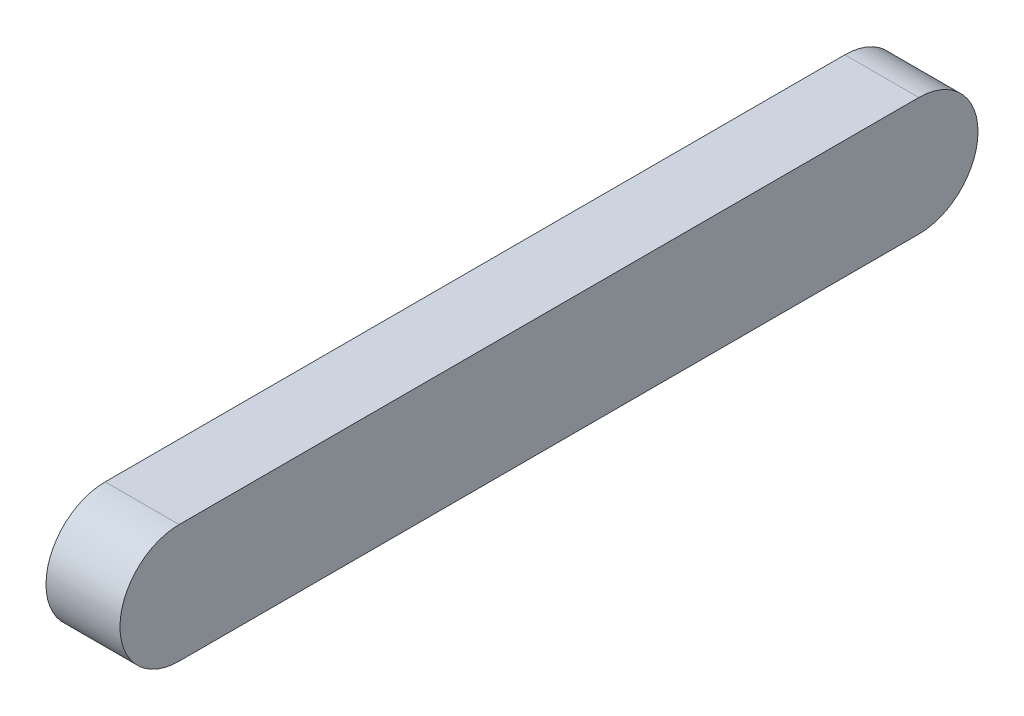
ISO-10303-21;
HEADER;
FILE_DESCRIPTION(('STEP AP214'),'2;1');
FILE_NAME('part.step','',(''),(''),'','','');
FILE_SCHEMA(('AUTOMOTIVE_DESIGN { 1 0 10303 214 1 1 1 1 }'));
ENDSEC;
DATA;
#1=APPLICATION_CONTEXT('core data for automotive mechanical design processes');
#2=APPLICATION_PROTOCOL_DEFINITION('international standard','automotive_design',2000,#1);
#3=PRODUCT_CONTEXT('',#1,'mechanical');
#4=PRODUCT('Part','Part','',(#3));
#5=PRODUCT_RELATED_PRODUCT_CATEGORY('part','',(#4));
#6=PRODUCT_DEFINITION_FORMATION('','',#4);
#7=PRODUCT_DEFINITION_CONTEXT('part definition',#1,'design');
#8=PRODUCT_DEFINITION('design','',#6,#7);
#9=PRODUCT_DEFINITION_SHAPE('','',#8);
#10=(LENGTH_UNIT() NAMED_UNIT(*) SI_UNIT(.MILLI.,.METRE.));
#11=(NAMED_UNIT(*) PLANE_ANGLE_UNIT() SI_UNIT($,.RADIAN.));
#12=(NAMED_UNIT(*) SI_UNIT($,.STERADIAN.) SOLID_ANGLE_UNIT());
#13=UNCERTAINTY_MEASURE_WITH_UNIT(LENGTH_MEASURE(1.E-05),#10,'distance_accuracy_value','');
#14=(GEOMETRIC_REPRESENTATION_CONTEXT(3) GLOBAL_UNCERTAINTY_ASSIGNED_CONTEXT((#13)) GLOBAL_UNIT_ASSIGNED_CONTEXT((#10,
#11,#12)) REPRESENTATION_CONTEXT('',''));
#15=CARTESIAN_POINT('',(0.,0.,0.));
#16=DIRECTION('',(0.,0.,1.));
#17=DIRECTION('',(1.,0.,0.));
#18=AXIS2_PLACEMENT_3D('',#15,#16,#17);
#19=CARTESIAN_POINT('',(3.175,0.,15.875));
#20=DIRECTION('',(-1.,0.,0.));
#21=DIRECTION('',(0.,0.,1.));
#22=AXIS2_PLACEMENT_3D('',#19,#20,#21);
#23=CYLINDRICAL_SURFACE('',#22,2.54);
#24=CARTESIAN_POINT('',(0.,0.,15.875));
#25=DIRECTION('',(1.,0.,0.));
#26=DIRECTION('',(0.,0.,-1.));
#27=AXIS2_PLACEMENT_3D('',#24,#25,#26);
#28=CIRCLE('',#27,2.54);
#29=CARTESIAN_POINT('',(0.,2.54,15.875));
#30=VERTEX_POINT('',#29);
#31=CARTESIAN_POINT('',(0.,-2.54,15.875));
#32=VERTEX_POINT('',#31);
#33=EDGE_CURVE('E96',#30,#32,#28,.T.);
#34=ORIENTED_EDGE('',*,*,#33,.T.);
#35=DIRECTION('',(-1.,0.,0.));
#36=VECTOR('',#35,1.);
#37=CARTESIAN_POINT('',(3.175,-2.54,15.875));
#38=LINE('',#37,#36);
#39=CARTESIAN_POINT('',(3.175,-2.54,15.875));
#40=VERTEX_POINT('',#39);
#41=EDGE_CURVE('E11',#40,#32,#38,.T.);
#42=ORIENTED_EDGE('',*,*,#41,.F.);
#43=CARTESIAN_POINT('',(3.175,0.,15.875));
#44=DIRECTION('',(1.,0.,0.));
#45=DIRECTION('',(0.,0.,-1.));
#46=AXIS2_PLACEMENT_3D('',#43,#44,#45);
#47=CIRCLE('',#46,2.54);
#48=CARTESIAN_POINT('',(3.175,2.54,15.875));
#49=VERTEX_POINT('',#48);
#50=EDGE_CURVE('E84',#49,#40,#47,.T.);
#51=ORIENTED_EDGE('',*,*,#50,.F.);
#52=DIRECTION('',(-1.,0.,0.));
#53=VECTOR('',#52,1.);
#54=CARTESIAN_POINT('',(3.175,2.54,15.875));
#55=LINE('',#54,#53);
#56=EDGE_CURVE('E92',#49,#30,#55,.T.);
#57=ORIENTED_EDGE('',*,*,#56,.T.);
#58=EDGE_LOOP('',(#34,#42,#51,#57));
#59=FACE_BOUND('',#58,.T.);
#60=ADVANCED_FACE('F33',(#59),#23,.T.);
#61=CARTESIAN_POINT('',(3.175,-2.54,15.875));
#62=DIRECTION('',(0.,1.,0.));
#63=DIRECTION('',(0.,0.,1.));
#64=AXIS2_PLACEMENT_3D('',#61,#62,#63);
#65=PLANE('',#64);
#66=DIRECTION('',(0.,0.,-1.));
#67=VECTOR('',#66,1.);
#68=CARTESIAN_POINT('',(0.,-2.54,15.875));
#69=LINE('',#68,#67);
#70=CARTESIAN_POINT('',(0.,-2.54,-15.875));
#71=VERTEX_POINT('',#70);
#72=EDGE_CURVE('E88',#32,#71,#69,.T.);
#73=ORIENTED_EDGE('',*,*,#72,.T.);
#74=DIRECTION('',(-1.,0.,0.));
#75=VECTOR('',#74,1.);
#76=CARTESIAN_POINT('',(3.175,-2.54,-15.875));
#77=LINE('',#76,#75);
#78=CARTESIAN_POINT('',(3.175,-2.54,-15.875));
#79=VERTEX_POINT('',#78);
#80=EDGE_CURVE('E41',#79,#71,#77,.T.);
#81=ORIENTED_EDGE('',*,*,#80,.F.);
#82=DIRECTION('',(0.,0.,-1.));
#83=VECTOR('',#82,1.);
#84=CARTESIAN_POINT('',(3.175,-2.54,15.875));
#85=LINE('',#84,#83);
#86=EDGE_CURVE('E79',#40,#79,#85,.T.);
#87=ORIENTED_EDGE('',*,*,#86,.F.);
#88=ORIENTED_EDGE('',*,*,#41,.T.);
#89=EDGE_LOOP('',(#73,#81,#87,#88));
#90=FACE_BOUND('',#89,.T.);
#91=ADVANCED_FACE('F87',(#90),#65,.F.);
#92=CARTESIAN_POINT('',(3.175,0.,-15.875));
#93=DIRECTION('',(-1.,0.,0.));
#94=DIRECTION('',(0.,0.,1.));
#95=AXIS2_PLACEMENT_3D('',#92,#93,#94);
#96=CYLINDRICAL_SURFACE('',#95,2.54);
#97=CARTESIAN_POINT('',(0.,0.,-15.875));
#98=DIRECTION('',(1.,0.,0.));
#99=DIRECTION('',(0.,0.,-1.));
#100=AXIS2_PLACEMENT_3D('',#97,#98,#99);
#101=CIRCLE('',#100,2.54);
#102=CARTESIAN_POINT('',(0.,2.54,-15.875));
#103=VERTEX_POINT('',#102);
#104=EDGE_CURVE('E66',#71,#103,#101,.T.);
#105=ORIENTED_EDGE('',*,*,#104,.T.);
#106=DIRECTION('',(-1.,0.,0.));
#107=VECTOR('',#106,1.);
#108=CARTESIAN_POINT('',(3.175,2.54,-15.875));
#109=LINE('',#108,#107);
#110=CARTESIAN_POINT('',(3.175,2.54,-15.875));
#111=VERTEX_POINT('',#110);
#112=EDGE_CURVE('E89',#111,#103,#109,.T.);
#113=ORIENTED_EDGE('',*,*,#112,.F.);
#114=CARTESIAN_POINT('',(3.175,0.,-15.875));
#115=DIRECTION('',(1.,0.,0.));
#116=DIRECTION('',(0.,0.,-1.));
#117=AXIS2_PLACEMENT_3D('',#114,#115,#116);
#118=CIRCLE('',#117,2.54);
#119=EDGE_CURVE('E82',#79,#111,#118,.T.);
#120=ORIENTED_EDGE('',*,*,#119,.F.);
#121=ORIENTED_EDGE('',*,*,#80,.T.);
#122=EDGE_LOOP('',(#105,#113,#120,#121));
#123=FACE_BOUND('',#122,.T.);
#124=ADVANCED_FACE('F90',(#123),#96,.T.);
#125=CARTESIAN_POINT('',(3.175,2.54,15.875));
#126=DIRECTION('',(0.,-1.,0.));
#127=DIRECTION('',(0.,0.,-1.));
#128=AXIS2_PLACEMENT_3D('',#125,#126,#127);
#129=PLANE('',#128);
#130=DIRECTION('',(0.,0.,1.));
#131=VECTOR('',#130,1.);
#132=CARTESIAN_POINT('',(0.,2.54,15.875));
#133=LINE('',#132,#131);
#134=EDGE_CURVE('E72',#103,#30,#133,.T.);
#135=ORIENTED_EDGE('',*,*,#134,.T.);
#136=ORIENTED_EDGE('',*,*,#56,.F.);
#137=DIRECTION('',(0.,0.,1.));
#138=VECTOR('',#137,1.);
#139=CARTESIAN_POINT('',(3.175,2.54,15.875));
#140=LINE('',#139,#138);
#141=EDGE_CURVE('E49',#111,#49,#140,.T.);
#142=ORIENTED_EDGE('',*,*,#141,.F.);
#143=ORIENTED_EDGE('',*,*,#112,.T.);
#144=EDGE_LOOP('',(#135,#136,#142,#143));
#145=FACE_BOUND('',#144,.T.);
#146=ADVANCED_FACE('F103',(#145),#129,.F.);
#147=CARTESIAN_POINT('',(3.175,0.,15.875));
#148=DIRECTION('',(1.,0.,0.));
#149=DIRECTION('',(0.,0.,-1.));
#150=AXIS2_PLACEMENT_3D('',#147,#148,#149);
#151=PLANE('',#150);
#152=ORIENTED_EDGE('',*,*,#50,.T.);
#153=ORIENTED_EDGE('',*,*,#86,.T.);
#154=ORIENTED_EDGE('',*,*,#119,.T.);
#155=ORIENTED_EDGE('',*,*,#141,.T.);
#156=EDGE_LOOP('',(#152,#153,#154,#155));
#157=FACE_BOUND('',#156,.T.);
#158=ADVANCED_FACE('F80',(#157),#151,.T.);
#159=CARTESIAN_POINT('',(0.,0.,15.875));
#160=DIRECTION('',(1.,0.,0.));
#161=DIRECTION('',(0.,0.,-1.));
#162=AXIS2_PLACEMENT_3D('',#159,#160,#161);
#163=PLANE('',#162);
#164=ORIENTED_EDGE('',*,*,#33,.F.);
#165=ORIENTED_EDGE('',*,*,#134,.F.);
#166=ORIENTED_EDGE('',*,*,#104,.F.);
#167=ORIENTED_EDGE('',*,*,#72,.F.);
#168=EDGE_LOOP('',(#164,#165,#166,#167));
#169=FACE_BOUND('',#168,.T.);
#170=ADVANCED_FACE('F106',(#169),#163,.F.);
#171=CLOSED_SHELL('',(#60,#91,#124,#146,#158,#170));
#172=MANIFOLD_SOLID_BREP('B2',#171);
#173=ADVANCED_BREP_SHAPE_REPRESENTATION('',(#18,#172),#14);
#174=SHAPE_DEFINITION_REPRESENTATION(#9,#173);
ENDSEC;
END-ISO-10303-21;
